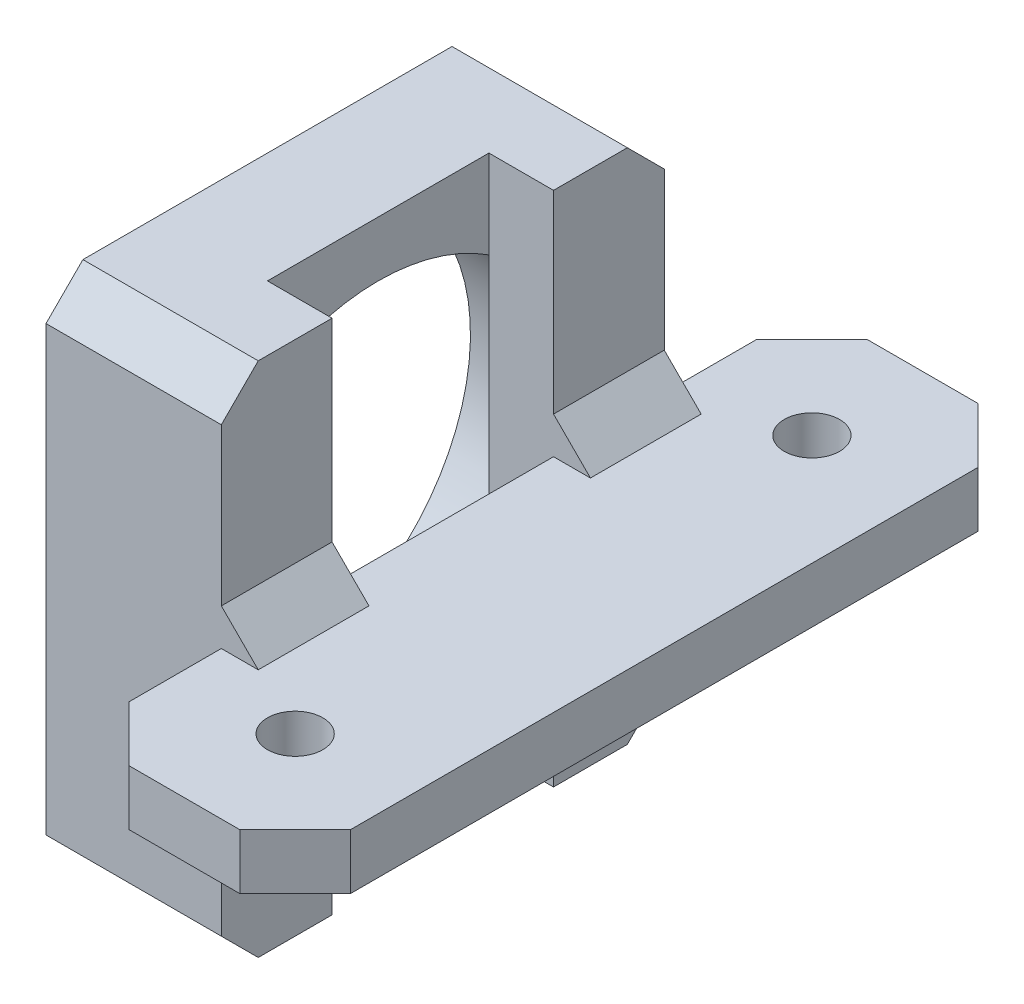
ISO-10303-21;
HEADER;
FILE_DESCRIPTION(('STEP AP214'),'2;1');
FILE_NAME('part.step','',(''),(''),'','','');
FILE_SCHEMA(('AUTOMOTIVE_DESIGN { 1 0 10303 214 1 1 1 1 }'));
ENDSEC;
DATA;
#1=APPLICATION_CONTEXT('core data for automotive mechanical design processes');
#2=APPLICATION_PROTOCOL_DEFINITION('international standard','automotive_design',2000,#1);
#3=PRODUCT_CONTEXT('',#1,'mechanical');
#4=PRODUCT('Part','Part','',(#3));
#5=PRODUCT_RELATED_PRODUCT_CATEGORY('part','',(#4));
#6=PRODUCT_DEFINITION_FORMATION('','',#4);
#7=PRODUCT_DEFINITION_CONTEXT('part definition',#1,'design');
#8=PRODUCT_DEFINITION('design','',#6,#7);
#9=PRODUCT_DEFINITION_SHAPE('','',#8);
#10=(LENGTH_UNIT() NAMED_UNIT(*) SI_UNIT(.MILLI.,.METRE.));
#11=(NAMED_UNIT(*) PLANE_ANGLE_UNIT() SI_UNIT($,.RADIAN.));
#12=(NAMED_UNIT(*) SI_UNIT($,.STERADIAN.) SOLID_ANGLE_UNIT());
#13=UNCERTAINTY_MEASURE_WITH_UNIT(LENGTH_MEASURE(1.E-05),#10,'distance_accuracy_value','');
#14=(GEOMETRIC_REPRESENTATION_CONTEXT(3) GLOBAL_UNCERTAINTY_ASSIGNED_CONTEXT((#13)) GLOBAL_UNIT_ASSIGNED_CONTEXT((#10,
#11,#12)) REPRESENTATION_CONTEXT('',''));
#15=CARTESIAN_POINT('',(0.,0.,0.));
#16=DIRECTION('',(0.,0.,1.));
#17=DIRECTION('',(1.,0.,0.));
#18=AXIS2_PLACEMENT_3D('',#15,#16,#17);
#19=CARTESIAN_POINT('',(-9.5,-12.5,6.));
#20=DIRECTION('',(-1.,0.,0.));
#21=DIRECTION('',(0.,0.,1.));
#22=AXIS2_PLACEMENT_3D('',#19,#20,#21);
#23=PLANE('',#22);
#24=DIRECTION('',(0.,1.,0.));
#25=VECTOR('',#24,1.);
#26=CARTESIAN_POINT('',(-9.5,-12.5,6.));
#27=LINE('',#26,#25);
#28=CARTESIAN_POINT('',(-9.5,-7.71954445729289,6.));
#29=VERTEX_POINT('',#28);
#30=CARTESIAN_POINT('',(-9.5,10.7195444572929,6.));
#31=VERTEX_POINT('',#30);
#32=EDGE_CURVE('E338',#29,#31,#27,.T.);
#33=ORIENTED_EDGE('',*,*,#32,.F.);
#34=CARTESIAN_POINT('',(-9.5,1.5,0.));
#35=DIRECTION('',(-1.,0.,0.));
#36=DIRECTION('',(0.,0.,1.));
#37=AXIS2_PLACEMENT_3D('',#34,#35,#36);
#38=CIRCLE('',#37,11.);
#39=EDGE_CURVE('E607',#29,#31,#38,.T.);
#40=ORIENTED_EDGE('',*,*,#39,.T.);
#41=EDGE_LOOP('',(#33,#40));
#42=FACE_BOUND('',#41,.T.);
#43=ADVANCED_FACE('F95',(#42),#23,.T.);
#44=CARTESIAN_POINT('',(-9.5,-12.5,-12.));
#45=DIRECTION('',(-1.,0.,0.));
#46=DIRECTION('',(0.,0.,1.));
#47=AXIS2_PLACEMENT_3D('',#44,#45,#46);
#48=PLANE('',#47);
#49=DIRECTION('',(0.,1.,0.));
#50=VECTOR('',#49,1.);
#51=CARTESIAN_POINT('',(-9.5,-12.5,-6.));
#52=LINE('',#51,#50);
#53=CARTESIAN_POINT('',(-9.5,-7.71954445729289,-6.));
#54=VERTEX_POINT('',#53);
#55=CARTESIAN_POINT('',(-9.5,10.7195444572929,-6.));
#56=VERTEX_POINT('',#55);
#57=EDGE_CURVE('E573',#54,#56,#52,.T.);
#58=ORIENTED_EDGE('',*,*,#57,.T.);
#59=EDGE_CURVE('E500',#56,#54,#38,.T.);
#60=ORIENTED_EDGE('',*,*,#59,.T.);
#61=EDGE_LOOP('',(#58,#60));
#62=FACE_BOUND('',#61,.T.);
#63=ADVANCED_FACE('F601',(#62),#48,.T.);
#64=CARTESIAN_POINT('',(-6.,3.,-17.));
#65=DIRECTION('',(1.,0.,0.));
#66=DIRECTION('',(0.,0.,-1.));
#67=AXIS2_PLACEMENT_3D('',#64,#65,#66);
#68=PLANE('',#67);
#69=DIRECTION('',(0.,1.,0.));
#70=VECTOR('',#69,1.);
#71=CARTESIAN_POINT('',(-6.,-12.5,-6.));
#72=LINE('',#71,#70);
#73=CARTESIAN_POINT('',(-6.,0.,-6.));
#74=VERTEX_POINT('',#73);
#75=CARTESIAN_POINT('',(-6.,3.,-6.));
#76=VERTEX_POINT('',#75);
#77=EDGE_CURVE('E444',#74,#76,#72,.T.);
#78=ORIENTED_EDGE('',*,*,#77,.F.);
#79=DIRECTION('',(0.,0.,1.));
#80=VECTOR('',#79,1.);
#81=CARTESIAN_POINT('',(-6.,0.,-17.));
#82=LINE('',#81,#80);
#83=CARTESIAN_POINT('',(-6.,0.,6.));
#84=VERTEX_POINT('',#83);
#85=EDGE_CURVE('E420',#74,#84,#82,.T.);
#86=ORIENTED_EDGE('',*,*,#85,.T.);
#87=DIRECTION('',(0.,1.,0.));
#88=VECTOR('',#87,1.);
#89=CARTESIAN_POINT('',(-6.,-12.5,6.));
#90=LINE('',#89,#88);
#91=CARTESIAN_POINT('',(-6.,3.,6.));
#92=VERTEX_POINT('',#91);
#93=EDGE_CURVE('E423',#84,#92,#90,.T.);
#94=ORIENTED_EDGE('',*,*,#93,.T.);
#95=DIRECTION('',(0.,0.,1.));
#96=VECTOR('',#95,1.);
#97=CARTESIAN_POINT('',(-6.,3.,-17.));
#98=LINE('',#97,#96);
#99=EDGE_CURVE('E398',#76,#92,#98,.T.);
#100=ORIENTED_EDGE('',*,*,#99,.F.);
#101=EDGE_LOOP('',(#78,#86,#94,#100));
#102=FACE_BOUND('',#101,.T.);
#103=ADVANCED_FACE('F665',(#102),#68,.F.);
#104=DIRECTION('',(0.,1.,0.));
#105=VECTOR('',#104,1.);
#106=CARTESIAN_POINT('',(-6.,-12.5,12.));
#107=LINE('',#106,#105);
#108=CARTESIAN_POINT('',(-6.,0.,12.));
#109=VERTEX_POINT('',#108);
#110=CARTESIAN_POINT('',(-6.,3.,12.));
#111=VERTEX_POINT('',#110);
#112=EDGE_CURVE('E545',#109,#111,#107,.T.);
#113=ORIENTED_EDGE('',*,*,#112,.F.);
#114=CARTESIAN_POINT('',(-6.,0.,17.));
#115=VERTEX_POINT('',#114);
#116=EDGE_CURVE('E417',#109,#115,#82,.T.);
#117=ORIENTED_EDGE('',*,*,#116,.T.);
#118=DIRECTION('',(0.,-1.,0.));
#119=VECTOR('',#118,1.);
#120=CARTESIAN_POINT('',(-6.,3.,17.));
#121=LINE('',#120,#119);
#122=CARTESIAN_POINT('',(-6.,3.,17.));
#123=VERTEX_POINT('',#122);
#124=EDGE_CURVE('E424',#123,#115,#121,.T.);
#125=ORIENTED_EDGE('',*,*,#124,.F.);
#126=EDGE_CURVE('E393',#111,#123,#98,.T.);
#127=ORIENTED_EDGE('',*,*,#126,.F.);
#128=EDGE_LOOP('',(#113,#117,#125,#127));
#129=FACE_BOUND('',#128,.T.);
#130=ADVANCED_FACE('F649',(#129),#68,.F.);
#131=CARTESIAN_POINT('',(0.,3.,0.));
#132=DIRECTION('',(0.,-1.,0.));
#133=DIRECTION('',(0.,0.,-1.));
#134=AXIS2_PLACEMENT_3D('',#131,#132,#133);
#135=PLANE('',#134);
#136=DIRECTION('',(0.,0.,1.));
#137=VECTOR('',#136,1.);
#138=CARTESIAN_POINT('',(-4.00000000000001,3.,-6.));
#139=LINE('',#138,#137);
#140=CARTESIAN_POINT('',(-4.00000000000001,3.,-12.));
#141=VERTEX_POINT('',#140);
#142=CARTESIAN_POINT('',(-4.00000000000001,3.,-6.));
#143=VERTEX_POINT('',#142);
#144=EDGE_CURVE('E474',#141,#143,#139,.T.);
#145=ORIENTED_EDGE('',*,*,#144,.T.);
#146=DIRECTION('',(-1.,0.,0.));
#147=VECTOR('',#146,1.);
#148=CARTESIAN_POINT('',(0.,3.,-6.));
#149=LINE('',#148,#147);
#150=EDGE_CURVE('E477',#143,#76,#149,.T.);
#151=ORIENTED_EDGE('',*,*,#150,.T.);
#152=ORIENTED_EDGE('',*,*,#99,.T.);
#153=DIRECTION('',(1.,0.,0.));
#154=VECTOR('',#153,1.);
#155=CARTESIAN_POINT('',(-9.5,3.,6.));
#156=LINE('',#155,#154);
#157=CARTESIAN_POINT('',(-4.00000000000001,3.,6.));
#158=VERTEX_POINT('',#157);
#159=EDGE_CURVE('E463',#92,#158,#156,.T.);
#160=ORIENTED_EDGE('',*,*,#159,.T.);
#161=DIRECTION('',(0.,0.,1.));
#162=VECTOR('',#161,1.);
#163=CARTESIAN_POINT('',(-4.00000000000001,3.,12.));
#164=LINE('',#163,#162);
#165=CARTESIAN_POINT('',(-4.00000000000001,3.,12.));
#166=VERTEX_POINT('',#165);
#167=EDGE_CURVE('E466',#158,#166,#164,.T.);
#168=ORIENTED_EDGE('',*,*,#167,.T.);
#169=DIRECTION('',(-1.,0.,0.));
#170=VECTOR('',#169,1.);
#171=CARTESIAN_POINT('',(0.,3.,12.));
#172=LINE('',#171,#170);
#173=EDGE_CURVE('E469',#166,#111,#172,.T.);
#174=ORIENTED_EDGE('',*,*,#173,.T.);
#175=ORIENTED_EDGE('',*,*,#126,.T.);
#176=DIRECTION('',(0.707106781186548,0.,0.707106781186547));
#177=VECTOR('',#176,1.);
#178=CARTESIAN_POINT('',(-6.,3.,17.));
#179=LINE('',#178,#177);
#180=CARTESIAN_POINT('',(-2.99999999999999,3.,20.));
#181=VERTEX_POINT('',#180);
#182=EDGE_CURVE('E391',#123,#181,#179,.T.);
#183=ORIENTED_EDGE('',*,*,#182,.T.);
#184=DIRECTION('',(1.,0.,0.));
#185=VECTOR('',#184,1.);
#186=CARTESIAN_POINT('',(-2.99999999999999,3.,20.));
#187=LINE('',#186,#185);
#188=CARTESIAN_POINT('',(3.00000000000001,3.,20.));
#189=VERTEX_POINT('',#188);
#190=EDGE_CURVE('E389',#181,#189,#187,.T.);
#191=ORIENTED_EDGE('',*,*,#190,.T.);
#192=DIRECTION('',(0.707106781186548,0.,-0.707106781186548));
#193=VECTOR('',#192,1.);
#194=CARTESIAN_POINT('',(3.00000000000001,3.,20.));
#195=LINE('',#194,#193);
#196=CARTESIAN_POINT('',(6.,3.,17.));
#197=VERTEX_POINT('',#196);
#198=EDGE_CURVE('E387',#189,#197,#195,.T.);
#199=ORIENTED_EDGE('',*,*,#198,.T.);
#200=DIRECTION('',(0.,0.,1.));
#201=VECTOR('',#200,1.);
#202=CARTESIAN_POINT('',(6.,3.,-17.));
#203=LINE('',#202,#201);
#204=CARTESIAN_POINT('',(6.,3.,-17.));
#205=VERTEX_POINT('',#204);
#206=EDGE_CURVE('E384',#205,#197,#203,.T.);
#207=ORIENTED_EDGE('',*,*,#206,.F.);
#208=DIRECTION('',(0.707106781186548,0.,0.707106781186547));
#209=VECTOR('',#208,1.);
#210=CARTESIAN_POINT('',(3.,3.,-20.));
#211=LINE('',#210,#209);
#212=CARTESIAN_POINT('',(3.,3.,-20.));
#213=VERTEX_POINT('',#212);
#214=EDGE_CURVE('E381',#213,#205,#211,.T.);
#215=ORIENTED_EDGE('',*,*,#214,.F.);
#216=DIRECTION('',(1.,0.,0.));
#217=VECTOR('',#216,1.);
#218=CARTESIAN_POINT('',(-3.,3.,-20.));
#219=LINE('',#218,#217);
#220=CARTESIAN_POINT('',(-3.,3.,-20.));
#221=VERTEX_POINT('',#220);
#222=EDGE_CURVE('E377',#221,#213,#219,.T.);
#223=ORIENTED_EDGE('',*,*,#222,.F.);
#224=DIRECTION('',(0.707106781186548,0.,-0.707106781186548));
#225=VECTOR('',#224,1.);
#226=CARTESIAN_POINT('',(-6.,3.,-17.));
#227=LINE('',#226,#225);
#228=CARTESIAN_POINT('',(-6.,3.,-17.));
#229=VERTEX_POINT('',#228);
#230=EDGE_CURVE('E374',#229,#221,#227,.T.);
#231=ORIENTED_EDGE('',*,*,#230,.F.);
#232=CARTESIAN_POINT('',(-6.,3.,-12.));
#233=VERTEX_POINT('',#232);
#234=EDGE_CURVE('E394',#229,#233,#98,.T.);
#235=ORIENTED_EDGE('',*,*,#234,.T.);
#236=DIRECTION('',(1.,0.,0.));
#237=VECTOR('',#236,1.);
#238=CARTESIAN_POINT('',(-9.5,3.,-12.));
#239=LINE('',#238,#237);
#240=EDGE_CURVE('E471',#233,#141,#239,.T.);
#241=ORIENTED_EDGE('',*,*,#240,.T.);
#242=EDGE_LOOP('',(#145,#151,#152,#160,#168,#174,#175,#183,#191,#199,#207,#215,#223,#231,#235,#241));
#243=FACE_BOUND('',#242,.T.);
#244=CARTESIAN_POINT('',(0.,3.,-14.));
#245=DIRECTION('',(0.,1.,0.));
#246=DIRECTION('',(0.,0.,1.));
#247=AXIS2_PLACEMENT_3D('',#244,#245,#246);
#248=CIRCLE('',#247,1.5);
#249=CARTESIAN_POINT('',(0.,3.,-12.5));
#250=VERTEX_POINT('',#249);
#251=EDGE_CURVE('E368',#250,#250,#248,.T.);
#252=ORIENTED_EDGE('',*,*,#251,.F.);
#253=EDGE_LOOP('',(#252));
#254=FACE_BOUND('',#253,.T.);
#255=CARTESIAN_POINT('',(0.,3.,14.));
#256=DIRECTION('',(0.,1.,0.));
#257=DIRECTION('',(0.,0.,1.));
#258=AXIS2_PLACEMENT_3D('',#255,#256,#257);
#259=CIRCLE('',#258,1.5);
#260=CARTESIAN_POINT('',(0.,3.,15.5));
#261=VERTEX_POINT('',#260);
#262=EDGE_CURVE('E360',#261,#261,#259,.T.);
#263=ORIENTED_EDGE('',*,*,#262,.F.);
#264=EDGE_LOOP('',(#263));
#265=FACE_BOUND('',#264,.T.);
#266=ADVANCED_FACE('F661',(#243,#254,#265),#135,.F.);
#267=CARTESIAN_POINT('',(0.,0.,0.));
#268=DIRECTION('',(0.,-1.,0.));
#269=DIRECTION('',(0.,0.,-1.));
#270=AXIS2_PLACEMENT_3D('',#267,#268,#269);
#271=PLANE('',#270);
#272=CARTESIAN_POINT('',(0.,0.,-14.));
#273=DIRECTION('',(0.,1.,0.));
#274=DIRECTION('',(0.,0.,1.));
#275=AXIS2_PLACEMENT_3D('',#272,#273,#274);
#276=CIRCLE('',#275,1.5);
#277=CARTESIAN_POINT('',(0.,0.,-12.5));
#278=VERTEX_POINT('',#277);
#279=EDGE_CURVE('E363',#278,#278,#276,.T.);
#280=ORIENTED_EDGE('',*,*,#279,.T.);
#281=EDGE_LOOP('',(#280));
#282=FACE_BOUND('',#281,.T.);
#283=ORIENTED_EDGE('',*,*,#85,.F.);
#284=DIRECTION('',(1.,0.,0.));
#285=VECTOR('',#284,1.);
#286=CARTESIAN_POINT('',(-9.5,0.,-6.));
#287=LINE('',#286,#285);
#288=CARTESIAN_POINT('',(-4.,0.,-6.));
#289=VERTEX_POINT('',#288);
#290=EDGE_CURVE('E457',#74,#289,#287,.T.);
#291=ORIENTED_EDGE('',*,*,#290,.T.);
#292=DIRECTION('',(0.,0.,-1.));
#293=VECTOR('',#292,1.);
#294=CARTESIAN_POINT('',(-4.,0.,0.));
#295=LINE('',#294,#293);
#296=CARTESIAN_POINT('',(-4.00000000000001,0.,-12.));
#297=VERTEX_POINT('',#296);
#298=EDGE_CURVE('E454',#289,#297,#295,.T.);
#299=ORIENTED_EDGE('',*,*,#298,.T.);
#300=DIRECTION('',(-1.,0.,0.));
#301=VECTOR('',#300,1.);
#302=CARTESIAN_POINT('',(0.,0.,-12.));
#303=LINE('',#302,#301);
#304=CARTESIAN_POINT('',(-6.,0.,-12.));
#305=VERTEX_POINT('',#304);
#306=EDGE_CURVE('E452',#297,#305,#303,.T.);
#307=ORIENTED_EDGE('',*,*,#306,.T.);
#308=CARTESIAN_POINT('',(-6.,0.,-17.));
#309=VERTEX_POINT('',#308);
#310=EDGE_CURVE('E378',#309,#305,#82,.T.);
#311=ORIENTED_EDGE('',*,*,#310,.F.);
#312=DIRECTION('',(0.707106781186548,0.,-0.707106781186548));
#313=VECTOR('',#312,1.);
#314=CARTESIAN_POINT('',(-6.,0.,-17.));
#315=LINE('',#314,#313);
#316=CARTESIAN_POINT('',(-3.,0.,-20.));
#317=VERTEX_POINT('',#316);
#318=EDGE_CURVE('E371',#309,#317,#315,.T.);
#319=ORIENTED_EDGE('',*,*,#318,.T.);
#320=DIRECTION('',(1.,0.,0.));
#321=VECTOR('',#320,1.);
#322=CARTESIAN_POINT('',(-3.,0.,-20.));
#323=LINE('',#322,#321);
#324=CARTESIAN_POINT('',(3.,0.,-20.));
#325=VERTEX_POINT('',#324);
#326=EDGE_CURVE('E401',#317,#325,#323,.T.);
#327=ORIENTED_EDGE('',*,*,#326,.T.);
#328=DIRECTION('',(0.707106781186548,0.,0.707106781186547));
#329=VECTOR('',#328,1.);
#330=CARTESIAN_POINT('',(3.,0.,-20.));
#331=LINE('',#330,#329);
#332=CARTESIAN_POINT('',(6.,0.,-17.));
#333=VERTEX_POINT('',#332);
#334=EDGE_CURVE('E404',#325,#333,#331,.T.);
#335=ORIENTED_EDGE('',*,*,#334,.T.);
#336=DIRECTION('',(0.,0.,1.));
#337=VECTOR('',#336,1.);
#338=CARTESIAN_POINT('',(6.,0.,-17.));
#339=LINE('',#338,#337);
#340=CARTESIAN_POINT('',(6.,0.,17.));
#341=VERTEX_POINT('',#340);
#342=EDGE_CURVE('E407',#333,#341,#339,.T.);
#343=ORIENTED_EDGE('',*,*,#342,.T.);
#344=DIRECTION('',(0.707106781186548,0.,-0.707106781186548));
#345=VECTOR('',#344,1.);
#346=CARTESIAN_POINT('',(3.00000000000001,0.,20.));
#347=LINE('',#346,#345);
#348=CARTESIAN_POINT('',(3.00000000000001,0.,20.));
#349=VERTEX_POINT('',#348);
#350=EDGE_CURVE('E410',#349,#341,#347,.T.);
#351=ORIENTED_EDGE('',*,*,#350,.F.);
#352=DIRECTION('',(1.,0.,0.));
#353=VECTOR('',#352,1.);
#354=CARTESIAN_POINT('',(-2.99999999999999,0.,20.));
#355=LINE('',#354,#353);
#356=CARTESIAN_POINT('',(-2.99999999999999,0.,20.));
#357=VERTEX_POINT('',#356);
#358=EDGE_CURVE('E413',#357,#349,#355,.T.);
#359=ORIENTED_EDGE('',*,*,#358,.F.);
#360=DIRECTION('',(0.707106781186548,0.,0.707106781186547));
#361=VECTOR('',#360,1.);
#362=CARTESIAN_POINT('',(-6.,0.,17.));
#363=LINE('',#362,#361);
#364=EDGE_CURVE('E415',#115,#357,#363,.T.);
#365=ORIENTED_EDGE('',*,*,#364,.F.);
#366=ORIENTED_EDGE('',*,*,#116,.F.);
#367=DIRECTION('',(1.,0.,0.));
#368=VECTOR('',#367,1.);
#369=CARTESIAN_POINT('',(-9.5,0.,12.));
#370=LINE('',#369,#368);
#371=CARTESIAN_POINT('',(-4.,0.,12.));
#372=VERTEX_POINT('',#371);
#373=EDGE_CURVE('E449',#109,#372,#370,.T.);
#374=ORIENTED_EDGE('',*,*,#373,.T.);
#375=DIRECTION('',(0.,0.,-1.));
#376=VECTOR('',#375,1.);
#377=CARTESIAN_POINT('',(-4.00000000000001,0.,0.));
#378=LINE('',#377,#376);
#379=CARTESIAN_POINT('',(-4.00000000000001,0.,6.));
#380=VERTEX_POINT('',#379);
#381=EDGE_CURVE('E446',#372,#380,#378,.T.);
#382=ORIENTED_EDGE('',*,*,#381,.T.);
#383=DIRECTION('',(-1.,0.,0.));
#384=VECTOR('',#383,1.);
#385=CARTESIAN_POINT('',(0.,0.,6.00000000000001));
#386=LINE('',#385,#384);
#387=EDGE_CURVE('E443',#380,#84,#386,.T.);
#388=ORIENTED_EDGE('',*,*,#387,.T.);
#389=EDGE_LOOP('',(#283,#291,#299,#307,#311,#319,#327,#335,#343,#351,#359,#365,#366,#374,#382,#388));
#390=FACE_BOUND('',#389,.T.);
#391=CARTESIAN_POINT('',(0.,0.,14.));
#392=DIRECTION('',(0.,1.,0.));
#393=DIRECTION('',(0.,0.,1.));
#394=AXIS2_PLACEMENT_3D('',#391,#392,#393);
#395=CIRCLE('',#394,1.5);
#396=CARTESIAN_POINT('',(0.,0.,15.5));
#397=VERTEX_POINT('',#396);
#398=EDGE_CURVE('E364',#397,#397,#395,.T.);
#399=ORIENTED_EDGE('',*,*,#398,.T.);
#400=EDGE_LOOP('',(#399));
#401=FACE_BOUND('',#400,.T.);
#402=ADVANCED_FACE('F641',(#282,#390,#401),#271,.T.);
#403=CARTESIAN_POINT('',(-6.,3.,-17.));
#404=DIRECTION('',(-0.707106781186547,0.,-0.707106781186547));
#405=DIRECTION('',(-0.707106781186548,0.,0.707106781186548));
#406=AXIS2_PLACEMENT_3D('',#403,#404,#405);
#407=PLANE('',#406);
#408=ORIENTED_EDGE('',*,*,#318,.F.);
#409=DIRECTION('',(0.,-1.,0.));
#410=VECTOR('',#409,1.);
#411=CARTESIAN_POINT('',(-6.,3.,-17.));
#412=LINE('',#411,#410);
#413=EDGE_CURVE('E421',#229,#309,#412,.T.);
#414=ORIENTED_EDGE('',*,*,#413,.F.);
#415=ORIENTED_EDGE('',*,*,#230,.T.);
#416=DIRECTION('',(0.,-1.,0.));
#417=VECTOR('',#416,1.);
#418=CARTESIAN_POINT('',(-3.,3.,-20.));
#419=LINE('',#418,#417);
#420=EDGE_CURVE('E397',#221,#317,#419,.T.);
#421=ORIENTED_EDGE('',*,*,#420,.T.);
#422=EDGE_LOOP('',(#408,#414,#415,#421));
#423=FACE_BOUND('',#422,.T.);
#424=ADVANCED_FACE('F677',(#423),#407,.T.);
#425=ORIENTED_EDGE('',*,*,#310,.T.);
#426=DIRECTION('',(0.,1.,0.));
#427=VECTOR('',#426,1.);
#428=CARTESIAN_POINT('',(-6.,-12.5,-12.));
#429=LINE('',#428,#427);
#430=EDGE_CURVE('E577',#305,#233,#429,.T.);
#431=ORIENTED_EDGE('',*,*,#430,.T.);
#432=ORIENTED_EDGE('',*,*,#234,.F.);
#433=ORIENTED_EDGE('',*,*,#413,.T.);
#434=EDGE_LOOP('',(#425,#431,#432,#433));
#435=FACE_BOUND('',#434,.T.);
#436=ADVANCED_FACE('F706',(#435),#68,.F.);
#437=CARTESIAN_POINT('',(-6.,3.,17.));
#438=DIRECTION('',(0.707106781186547,0.,-0.707106781186548));
#439=DIRECTION('',(-0.707106781186548,0.,-0.707106781186547));
#440=AXIS2_PLACEMENT_3D('',#437,#438,#439);
#441=PLANE('',#440);
#442=ORIENTED_EDGE('',*,*,#364,.T.);
#443=DIRECTION('',(0.,-1.,0.));
#444=VECTOR('',#443,1.);
#445=CARTESIAN_POINT('',(-2.99999999999999,3.,20.));
#446=LINE('',#445,#444);
#447=EDGE_CURVE('E427',#181,#357,#446,.T.);
#448=ORIENTED_EDGE('',*,*,#447,.F.);
#449=ORIENTED_EDGE('',*,*,#182,.F.);
#450=ORIENTED_EDGE('',*,*,#124,.T.);
#451=EDGE_LOOP('',(#442,#448,#449,#450));
#452=FACE_BOUND('',#451,.T.);
#453=ADVANCED_FACE('F704',(#452),#441,.F.);
#454=CARTESIAN_POINT('',(-2.99999999999999,3.,20.));
#455=DIRECTION('',(0.,0.,-1.));
#456=DIRECTION('',(-1.,0.,0.));
#457=AXIS2_PLACEMENT_3D('',#454,#455,#456);
#458=PLANE('',#457);
#459=ORIENTED_EDGE('',*,*,#358,.T.);
#460=DIRECTION('',(0.,-1.,0.));
#461=VECTOR('',#460,1.);
#462=CARTESIAN_POINT('',(3.00000000000001,3.,20.));
#463=LINE('',#462,#461);
#464=EDGE_CURVE('E430',#189,#349,#463,.T.);
#465=ORIENTED_EDGE('',*,*,#464,.F.);
#466=ORIENTED_EDGE('',*,*,#190,.F.);
#467=ORIENTED_EDGE('',*,*,#447,.T.);
#468=EDGE_LOOP('',(#459,#465,#466,#467));
#469=FACE_BOUND('',#468,.T.);
#470=ADVANCED_FACE('F699',(#469),#458,.F.);
#471=CARTESIAN_POINT('',(3.00000000000001,3.,20.));
#472=DIRECTION('',(-0.707106781186547,0.,-0.707106781186547));
#473=DIRECTION('',(-0.707106781186548,0.,0.707106781186548));
#474=AXIS2_PLACEMENT_3D('',#471,#472,#473);
#475=PLANE('',#474);
#476=ORIENTED_EDGE('',*,*,#350,.T.);
#477=DIRECTION('',(0.,-1.,0.));
#478=VECTOR('',#477,1.);
#479=CARTESIAN_POINT('',(6.,3.,17.));
#480=LINE('',#479,#478);
#481=EDGE_CURVE('E433',#197,#341,#480,.T.);
#482=ORIENTED_EDGE('',*,*,#481,.F.);
#483=ORIENTED_EDGE('',*,*,#198,.F.);
#484=ORIENTED_EDGE('',*,*,#464,.T.);
#485=EDGE_LOOP('',(#476,#482,#483,#484));
#486=FACE_BOUND('',#485,.T.);
#487=ADVANCED_FACE('F696',(#486),#475,.F.);
#488=CARTESIAN_POINT('',(6.,3.,-17.));
#489=DIRECTION('',(1.,0.,0.));
#490=DIRECTION('',(0.,0.,-1.));
#491=AXIS2_PLACEMENT_3D('',#488,#489,#490);
#492=PLANE('',#491);
#493=ORIENTED_EDGE('',*,*,#342,.F.);
#494=DIRECTION('',(0.,-1.,0.));
#495=VECTOR('',#494,1.);
#496=CARTESIAN_POINT('',(6.,3.,-17.));
#497=LINE('',#496,#495);
#498=EDGE_CURVE('E435',#205,#333,#497,.T.);
#499=ORIENTED_EDGE('',*,*,#498,.F.);
#500=ORIENTED_EDGE('',*,*,#206,.T.);
#501=ORIENTED_EDGE('',*,*,#481,.T.);
#502=EDGE_LOOP('',(#493,#499,#500,#501));
#503=FACE_BOUND('',#502,.T.);
#504=ADVANCED_FACE('F692',(#503),#492,.T.);
#505=CARTESIAN_POINT('',(3.,3.,-20.));
#506=DIRECTION('',(0.707106781186547,0.,-0.707106781186548));
#507=DIRECTION('',(-0.707106781186548,0.,-0.707106781186547));
#508=AXIS2_PLACEMENT_3D('',#505,#506,#507);
#509=PLANE('',#508);
#510=ORIENTED_EDGE('',*,*,#334,.F.);
#511=DIRECTION('',(0.,-1.,0.));
#512=VECTOR('',#511,1.);
#513=CARTESIAN_POINT('',(3.,3.,-20.));
#514=LINE('',#513,#512);
#515=EDGE_CURVE('E437',#213,#325,#514,.T.);
#516=ORIENTED_EDGE('',*,*,#515,.F.);
#517=ORIENTED_EDGE('',*,*,#214,.T.);
#518=ORIENTED_EDGE('',*,*,#498,.T.);
#519=EDGE_LOOP('',(#510,#516,#517,#518));
#520=FACE_BOUND('',#519,.T.);
#521=ADVANCED_FACE('F688',(#520),#509,.T.);
#522=CARTESIAN_POINT('',(-3.,3.,-20.));
#523=DIRECTION('',(0.,0.,-1.));
#524=DIRECTION('',(-1.,0.,0.));
#525=AXIS2_PLACEMENT_3D('',#522,#523,#524);
#526=PLANE('',#525);
#527=ORIENTED_EDGE('',*,*,#326,.F.);
#528=ORIENTED_EDGE('',*,*,#420,.F.);
#529=ORIENTED_EDGE('',*,*,#222,.T.);
#530=ORIENTED_EDGE('',*,*,#515,.T.);
#531=EDGE_LOOP('',(#527,#528,#529,#530));
#532=FACE_BOUND('',#531,.T.);
#533=ADVANCED_FACE('F683',(#532),#526,.T.);
#534=CARTESIAN_POINT('',(0.,3.,-14.));
#535=DIRECTION('',(0.,-1.,0.));
#536=DIRECTION('',(0.,0.,-1.));
#537=AXIS2_PLACEMENT_3D('',#534,#535,#536);
#538=CYLINDRICAL_SURFACE('',#537,1.5);
#539=ORIENTED_EDGE('',*,*,#251,.T.);
#540=EDGE_LOOP('',(#539));
#541=FACE_BOUND('',#540,.T.);
#542=ORIENTED_EDGE('',*,*,#279,.F.);
#543=EDGE_LOOP('',(#542));
#544=FACE_BOUND('',#543,.T.);
#545=ADVANCED_FACE('F732',(#541,#544),#538,.F.);
#546=CARTESIAN_POINT('',(0.,3.,14.));
#547=DIRECTION('',(0.,-1.,0.));
#548=DIRECTION('',(0.,0.,-1.));
#549=AXIS2_PLACEMENT_3D('',#546,#547,#548);
#550=CYLINDRICAL_SURFACE('',#549,1.5);
#551=ORIENTED_EDGE('',*,*,#262,.T.);
#552=EDGE_LOOP('',(#551));
#553=FACE_BOUND('',#552,.T.);
#554=ORIENTED_EDGE('',*,*,#398,.F.);
#555=EDGE_LOOP('',(#554));
#556=FACE_BOUND('',#555,.T.);
#557=ADVANCED_FACE('F729',(#553,#556),#550,.F.);
#558=CARTESIAN_POINT('',(-6.,-12.5,6.));
#559=DIRECTION('',(-1.,0.,0.));
#560=DIRECTION('',(0.,0.,1.));
#561=AXIS2_PLACEMENT_3D('',#558,#559,#560);
#562=PLANE('',#561);
#563=CARTESIAN_POINT('',(-6.,-10.5,12.));
#564=VERTEX_POINT('',#563);
#565=CARTESIAN_POINT('',(-6.,-1.99999999999999,12.));
#566=VERTEX_POINT('',#565);
#567=EDGE_CURVE('E542',#564,#566,#107,.T.);
#568=ORIENTED_EDGE('',*,*,#567,.F.);
#569=DIRECTION('',(0.,0.707106781186546,0.707106781186549));
#570=VECTOR('',#569,1.);
#571=CARTESIAN_POINT('',(-6.,-10.5,12.));
#572=LINE('',#571,#570);
#573=CARTESIAN_POINT('',(-6.,-12.5,9.99999999999999));
#574=VERTEX_POINT('',#573);
#575=EDGE_CURVE('E526',#564,#574,#572,.F.);
#576=ORIENTED_EDGE('',*,*,#575,.T.);
#577=DIRECTION('',(0.,0.,1.));
#578=VECTOR('',#577,1.);
#579=CARTESIAN_POINT('',(-6.,-12.5,6.));
#580=LINE('',#579,#578);
#581=CARTESIAN_POINT('',(-6.,-12.5,6.));
#582=VERTEX_POINT('',#581);
#583=EDGE_CURVE('E355',#582,#574,#580,.T.);
#584=ORIENTED_EDGE('',*,*,#583,.F.);
#585=CARTESIAN_POINT('',(-6.,-1.99999999999999,6.));
#586=VERTEX_POINT('',#585);
#587=EDGE_CURVE('E543',#582,#586,#90,.T.);
#588=ORIENTED_EDGE('',*,*,#587,.T.);
#589=DIRECTION('',(0.,0.,1.));
#590=VECTOR('',#589,1.);
#591=CARTESIAN_POINT('',(-6.,-1.99999999999999,6.));
#592=LINE('',#591,#590);
#593=EDGE_CURVE('E460',#586,#566,#592,.T.);
#594=ORIENTED_EDGE('',*,*,#593,.T.);
#595=EDGE_LOOP('',(#568,#576,#584,#588,#594));
#596=FACE_BOUND('',#595,.T.);
#597=ADVANCED_FACE('F631',(#596),#562,.F.);
#598=CARTESIAN_POINT('',(-9.5,-12.5,6.));
#599=DIRECTION('',(0.,0.,1.));
#600=DIRECTION('',(1.,0.,0.));
#601=AXIS2_PLACEMENT_3D('',#598,#599,#600);
#602=PLANE('',#601);
#603=DIRECTION('',(1.,0.,0.));
#604=VECTOR('',#603,1.);
#605=CARTESIAN_POINT('',(-9.5,15.5,6.));
#606=LINE('',#605,#604);
#607=CARTESIAN_POINT('',(-9.5,15.5,6.));
#608=VERTEX_POINT('',#607);
#609=CARTESIAN_POINT('',(-6.,15.5,6.));
#610=VERTEX_POINT('',#609);
#611=EDGE_CURVE('E335',#608,#610,#606,.T.);
#612=ORIENTED_EDGE('',*,*,#611,.T.);
#613=CARTESIAN_POINT('',(-6.,4.99999999999999,6.));
#614=VERTEX_POINT('',#613);
#615=EDGE_CURVE('E339',#614,#610,#90,.T.);
#616=ORIENTED_EDGE('',*,*,#615,.F.);
#617=DIRECTION('',(-0.707106781186548,0.707106781186547,0.));
#618=VECTOR('',#617,1.);
#619=CARTESIAN_POINT('',(0.99999999999999,-2.,6.00000000000001));
#620=LINE('',#619,#618);
#621=EDGE_CURVE('E498',#614,#158,#620,.F.);
#622=ORIENTED_EDGE('',*,*,#621,.T.);
#623=ORIENTED_EDGE('',*,*,#159,.F.);
#624=ORIENTED_EDGE('',*,*,#93,.F.);
#625=ORIENTED_EDGE('',*,*,#387,.F.);
#626=DIRECTION('',(-0.707106781186548,-0.707106781186547,0.));
#627=VECTOR('',#626,1.);
#628=CARTESIAN_POINT('',(-13.,-9.,6.));
#629=LINE('',#628,#627);
#630=EDGE_CURVE('E490',#380,#586,#629,.T.);
#631=ORIENTED_EDGE('',*,*,#630,.T.);
#632=ORIENTED_EDGE('',*,*,#587,.F.);
#633=DIRECTION('',(1.,0.,0.));
#634=VECTOR('',#633,1.);
#635=CARTESIAN_POINT('',(-9.5,-12.5,6.));
#636=LINE('',#635,#634);
#637=CARTESIAN_POINT('',(-9.5,-12.5,6.));
#638=VERTEX_POINT('',#637);
#639=EDGE_CURVE('E352',#638,#582,#636,.T.);
#640=ORIENTED_EDGE('',*,*,#639,.F.);
#641=EDGE_CURVE('E342',#638,#29,#27,.T.);
#642=ORIENTED_EDGE('',*,*,#641,.T.);
#643=ORIENTED_EDGE('',*,*,#32,.T.);
#644=EDGE_CURVE('E319',#31,#608,#27,.T.);
#645=ORIENTED_EDGE('',*,*,#644,.T.);
#646=EDGE_LOOP('',(#612,#616,#622,#623,#624,#625,#631,#632,#640,#642,#643,#645));
#647=FACE_BOUND('',#646,.T.);
#648=ADVANCED_FACE('F333',(#647),#602,.F.);
#649=DIRECTION('',(0.,0.,1.));
#650=VECTOR('',#649,1.);
#651=CARTESIAN_POINT('',(-6.,15.5,6.));
#652=LINE('',#651,#650);
#653=CARTESIAN_POINT('',(-6.,15.5,10.));
#654=VERTEX_POINT('',#653);
#655=EDGE_CURVE('E347',#610,#654,#652,.T.);
#656=ORIENTED_EDGE('',*,*,#655,.T.);
#657=DIRECTION('',(0.,-0.707106781186549,0.707106781186546));
#658=VECTOR('',#657,1.);
#659=CARTESIAN_POINT('',(-6.,15.5,10.));
#660=LINE('',#659,#658);
#661=CARTESIAN_POINT('',(-6.,13.5,12.));
#662=VERTEX_POINT('',#661);
#663=EDGE_CURVE('E104',#654,#662,#660,.T.);
#664=ORIENTED_EDGE('',*,*,#663,.T.);
#665=CARTESIAN_POINT('',(-6.,4.99999999999999,12.));
#666=VERTEX_POINT('',#665);
#667=EDGE_CURVE('E535',#666,#662,#107,.T.);
#668=ORIENTED_EDGE('',*,*,#667,.F.);
#669=DIRECTION('',(0.,0.,-1.));
#670=VECTOR('',#669,1.);
#671=CARTESIAN_POINT('',(-6.,4.99999999999999,6.));
#672=LINE('',#671,#670);
#673=EDGE_CURVE('E481',#666,#614,#672,.T.);
#674=ORIENTED_EDGE('',*,*,#673,.T.);
#675=ORIENTED_EDGE('',*,*,#615,.T.);
#676=EDGE_LOOP('',(#656,#664,#668,#674,#675));
#677=FACE_BOUND('',#676,.T.);
#678=ADVANCED_FACE('F534',(#677),#562,.F.);
#679=CARTESIAN_POINT('',(-9.5,-12.5,12.));
#680=DIRECTION('',(0.,0.,1.));
#681=DIRECTION('',(1.,0.,0.));
#682=AXIS2_PLACEMENT_3D('',#679,#680,#681);
#683=PLANE('',#682);
#684=DIRECTION('',(0.,1.,0.));
#685=VECTOR('',#684,1.);
#686=CARTESIAN_POINT('',(-15.5,15.5,12.));
#687=LINE('',#686,#685);
#688=CARTESIAN_POINT('',(-15.5,-10.5,12.));
#689=VERTEX_POINT('',#688);
#690=CARTESIAN_POINT('',(-15.5,13.5,12.));
#691=VERTEX_POINT('',#690);
#692=EDGE_CURVE('E554',#689,#691,#687,.T.);
#693=ORIENTED_EDGE('',*,*,#692,.F.);
#694=DIRECTION('',(1.,0.,0.));
#695=VECTOR('',#694,1.);
#696=CARTESIAN_POINT('',(-9.5,-10.5,12.));
#697=LINE('',#696,#695);
#698=EDGE_CURVE('E523',#689,#564,#697,.T.);
#699=ORIENTED_EDGE('',*,*,#698,.T.);
#700=ORIENTED_EDGE('',*,*,#567,.T.);
#701=DIRECTION('',(0.707106781186548,0.707106781186547,0.));
#702=VECTOR('',#701,1.);
#703=CARTESIAN_POINT('',(-6.,-2.,12.));
#704=LINE('',#703,#702);
#705=EDGE_CURVE('E488',#566,#372,#704,.T.);
#706=ORIENTED_EDGE('',*,*,#705,.T.);
#707=ORIENTED_EDGE('',*,*,#373,.F.);
#708=ORIENTED_EDGE('',*,*,#112,.T.);
#709=ORIENTED_EDGE('',*,*,#173,.F.);
#710=DIRECTION('',(0.707106781186548,-0.707106781186547,0.));
#711=VECTOR('',#710,1.);
#712=CARTESIAN_POINT('',(-4.00000000000001,3.,12.));
#713=LINE('',#712,#711);
#714=EDGE_CURVE('E496',#166,#666,#713,.F.);
#715=ORIENTED_EDGE('',*,*,#714,.T.);
#716=ORIENTED_EDGE('',*,*,#667,.T.);
#717=DIRECTION('',(-1.,0.,0.));
#718=VECTOR('',#717,1.);
#719=CARTESIAN_POINT('',(-15.5,13.5,12.));
#720=LINE('',#719,#718);
#721=EDGE_CURVE('E521',#662,#691,#720,.T.);
#722=ORIENTED_EDGE('',*,*,#721,.T.);
#723=EDGE_LOOP('',(#693,#699,#700,#706,#707,#708,#709,#715,#716,#722));
#724=FACE_BOUND('',#723,.T.);
#725=ADVANCED_FACE('F539',(#724),#683,.T.);
#726=CARTESIAN_POINT('',(-6.,-12.5,-12.));
#727=DIRECTION('',(-1.,0.,0.));
#728=DIRECTION('',(0.,0.,1.));
#729=AXIS2_PLACEMENT_3D('',#726,#727,#728);
#730=PLANE('',#729);
#731=DIRECTION('',(0.,0.,1.));
#732=VECTOR('',#731,1.);
#733=CARTESIAN_POINT('',(-6.,-12.5,-12.));
#734=LINE('',#733,#732);
#735=CARTESIAN_POINT('',(-6.,-12.5,-9.99999999999999));
#736=VERTEX_POINT('',#735);
#737=CARTESIAN_POINT('',(-6.,-12.5,-6.));
#738=VERTEX_POINT('',#737);
#739=EDGE_CURVE('E567',#736,#738,#734,.T.);
#740=ORIENTED_EDGE('',*,*,#739,.F.);
#741=DIRECTION('',(0.,0.707106781186549,-0.707106781186546));
#742=VECTOR('',#741,1.);
#743=CARTESIAN_POINT('',(-6.,-12.5,-9.99999999999999));
#744=LINE('',#743,#742);
#745=CARTESIAN_POINT('',(-6.,-10.5,-12.));
#746=VERTEX_POINT('',#745);
#747=EDGE_CURVE('E506',#736,#746,#744,.T.);
#748=ORIENTED_EDGE('',*,*,#747,.T.);
#749=CARTESIAN_POINT('',(-6.,-1.99999999999999,-12.));
#750=VERTEX_POINT('',#749);
#751=EDGE_CURVE('E574',#746,#750,#429,.T.);
#752=ORIENTED_EDGE('',*,*,#751,.T.);
#753=DIRECTION('',(0.,0.,1.));
#754=VECTOR('',#753,1.);
#755=CARTESIAN_POINT('',(-6.,-1.99999999999999,-12.));
#756=LINE('',#755,#754);
#757=CARTESIAN_POINT('',(-6.,-1.99999999999999,-6.));
#758=VERTEX_POINT('',#757);
#759=EDGE_CURVE('E440',#750,#758,#756,.T.);
#760=ORIENTED_EDGE('',*,*,#759,.T.);
#761=EDGE_CURVE('E578',#738,#758,#72,.T.);
#762=ORIENTED_EDGE('',*,*,#761,.F.);
#763=EDGE_LOOP('',(#740,#748,#752,#760,#762));
#764=FACE_BOUND('',#763,.T.);
#765=ADVANCED_FACE('F822',(#764),#730,.F.);
#766=CARTESIAN_POINT('',(-9.5,-12.5,-6.));
#767=DIRECTION('',(0.,0.,1.));
#768=DIRECTION('',(1.,0.,0.));
#769=AXIS2_PLACEMENT_3D('',#766,#767,#768);
#770=PLANE('',#769);
#771=DIRECTION('',(1.,0.,0.));
#772=VECTOR('',#771,1.);
#773=CARTESIAN_POINT('',(-9.5,15.5,-6.));
#774=LINE('',#773,#772);
#775=CARTESIAN_POINT('',(-9.5,15.5,-6.));
#776=VERTEX_POINT('',#775);
#777=CARTESIAN_POINT('',(-6.,15.5,-6.));
#778=VERTEX_POINT('',#777);
#779=EDGE_CURVE('E348',#776,#778,#774,.T.);
#780=ORIENTED_EDGE('',*,*,#779,.F.);
#781=EDGE_CURVE('E322',#56,#776,#52,.T.);
#782=ORIENTED_EDGE('',*,*,#781,.F.);
#783=ORIENTED_EDGE('',*,*,#57,.F.);
#784=CARTESIAN_POINT('',(-9.5,-12.5,-6.));
#785=VERTEX_POINT('',#784);
#786=EDGE_CURVE('E367',#785,#54,#52,.T.);
#787=ORIENTED_EDGE('',*,*,#786,.F.);
#788=DIRECTION('',(1.,0.,0.));
#789=VECTOR('',#788,1.);
#790=CARTESIAN_POINT('',(-9.5,-12.5,-6.));
#791=LINE('',#790,#789);
#792=EDGE_CURVE('E564',#785,#738,#791,.T.);
#793=ORIENTED_EDGE('',*,*,#792,.T.);
#794=ORIENTED_EDGE('',*,*,#761,.T.);
#795=DIRECTION('',(0.707106781186548,0.707106781186548,0.));
#796=VECTOR('',#795,1.);
#797=CARTESIAN_POINT('',(-6.,-2.,-6.));
#798=LINE('',#797,#796);
#799=EDGE_CURVE('E483',#758,#289,#798,.T.);
#800=ORIENTED_EDGE('',*,*,#799,.T.);
#801=ORIENTED_EDGE('',*,*,#290,.F.);
#802=ORIENTED_EDGE('',*,*,#77,.T.);
#803=ORIENTED_EDGE('',*,*,#150,.F.);
#804=DIRECTION('',(0.707106781186548,-0.707106781186547,0.));
#805=VECTOR('',#804,1.);
#806=CARTESIAN_POINT('',(-4.00000000000001,3.,-6.));
#807=LINE('',#806,#805);
#808=CARTESIAN_POINT('',(-6.,4.99999999999999,-6.));
#809=VERTEX_POINT('',#808);
#810=EDGE_CURVE('E492',#143,#809,#807,.F.);
#811=ORIENTED_EDGE('',*,*,#810,.T.);
#812=EDGE_CURVE('E568',#809,#778,#72,.T.);
#813=ORIENTED_EDGE('',*,*,#812,.T.);
#814=EDGE_LOOP('',(#780,#782,#783,#787,#793,#794,#800,#801,#802,#803,#811,#813));
#815=FACE_BOUND('',#814,.T.);
#816=ADVANCED_FACE('F596',(#815),#770,.T.);
#817=CARTESIAN_POINT('',(-9.5,-12.5,-12.));
#818=DIRECTION('',(0.,0.,1.));
#819=DIRECTION('',(1.,0.,0.));
#820=AXIS2_PLACEMENT_3D('',#817,#818,#819);
#821=PLANE('',#820);
#822=ORIENTED_EDGE('',*,*,#751,.F.);
#823=DIRECTION('',(-1.,0.,0.));
#824=VECTOR('',#823,1.);
#825=CARTESIAN_POINT('',(-15.5,-10.5,-12.));
#826=LINE('',#825,#824);
#827=CARTESIAN_POINT('',(-15.5,-10.5,-12.));
#828=VERTEX_POINT('',#827);
#829=EDGE_CURVE('E511',#746,#828,#826,.T.);
#830=ORIENTED_EDGE('',*,*,#829,.T.);
#831=DIRECTION('',(0.,-1.,0.));
#832=VECTOR('',#831,1.);
#833=CARTESIAN_POINT('',(-15.5,15.5,-12.));
#834=LINE('',#833,#832);
#835=CARTESIAN_POINT('',(-15.5,13.5,-12.));
#836=VERTEX_POINT('',#835);
#837=EDGE_CURVE('E327',#836,#828,#834,.T.);
#838=ORIENTED_EDGE('',*,*,#837,.F.);
#839=DIRECTION('',(1.,0.,0.));
#840=VECTOR('',#839,1.);
#841=CARTESIAN_POINT('',(-9.5,13.5,-12.));
#842=LINE('',#841,#840);
#843=CARTESIAN_POINT('',(-6.,13.5,-12.));
#844=VERTEX_POINT('',#843);
#845=EDGE_CURVE('E508',#836,#844,#842,.T.);
#846=ORIENTED_EDGE('',*,*,#845,.T.);
#847=CARTESIAN_POINT('',(-6.,4.99999999999999,-12.));
#848=VERTEX_POINT('',#847);
#849=EDGE_CURVE('E576',#848,#844,#429,.T.);
#850=ORIENTED_EDGE('',*,*,#849,.F.);
#851=DIRECTION('',(-0.707106781186548,0.707106781186547,0.));
#852=VECTOR('',#851,1.);
#853=CARTESIAN_POINT('',(0.999999999999992,-2.,-12.));
#854=LINE('',#853,#852);
#855=EDGE_CURVE('E494',#848,#141,#854,.F.);
#856=ORIENTED_EDGE('',*,*,#855,.T.);
#857=ORIENTED_EDGE('',*,*,#240,.F.);
#858=ORIENTED_EDGE('',*,*,#430,.F.);
#859=ORIENTED_EDGE('',*,*,#306,.F.);
#860=DIRECTION('',(-0.707106781186548,-0.707106781186548,0.));
#861=VECTOR('',#860,1.);
#862=CARTESIAN_POINT('',(-13.,-9.,-12.));
#863=LINE('',#862,#861);
#864=EDGE_CURVE('E485',#297,#750,#863,.T.);
#865=ORIENTED_EDGE('',*,*,#864,.T.);
#866=EDGE_LOOP('',(#822,#830,#838,#846,#850,#856,#857,#858,#859,#865));
#867=FACE_BOUND('',#866,.T.);
#868=ADVANCED_FACE('F618',(#867),#821,.F.);
#869=ORIENTED_EDGE('',*,*,#849,.T.);
#870=DIRECTION('',(0.,-0.707106781186546,-0.707106781186549));
#871=VECTOR('',#870,1.);
#872=CARTESIAN_POINT('',(-6.,13.5,-12.));
#873=LINE('',#872,#871);
#874=CARTESIAN_POINT('',(-6.,15.5,-9.99999999999999));
#875=VERTEX_POINT('',#874);
#876=EDGE_CURVE('E12',#844,#875,#873,.F.);
#877=ORIENTED_EDGE('',*,*,#876,.T.);
#878=DIRECTION('',(0.,0.,1.));
#879=VECTOR('',#878,1.);
#880=CARTESIAN_POINT('',(-6.,15.5,-12.));
#881=LINE('',#880,#879);
#882=EDGE_CURVE('E350',#875,#778,#881,.T.);
#883=ORIENTED_EDGE('',*,*,#882,.T.);
#884=ORIENTED_EDGE('',*,*,#812,.F.);
#885=DIRECTION('',(0.,0.,-1.));
#886=VECTOR('',#885,1.);
#887=CARTESIAN_POINT('',(-6.,4.99999999999999,-12.));
#888=LINE('',#887,#886);
#889=EDGE_CURVE('E479',#809,#848,#888,.T.);
#890=ORIENTED_EDGE('',*,*,#889,.T.);
#891=EDGE_LOOP('',(#869,#877,#883,#884,#890));
#892=FACE_BOUND('',#891,.T.);
#893=ADVANCED_FACE('F797',(#892),#730,.F.);
#894=CARTESIAN_POINT('',(0.,-12.5,0.));
#895=DIRECTION('',(0.,-1.,0.));
#896=DIRECTION('',(0.,0.,-1.));
#897=AXIS2_PLACEMENT_3D('',#894,#895,#896);
#898=PLANE('',#897);
#899=DIRECTION('',(0.,0.,1.));
#900=VECTOR('',#899,1.);
#901=CARTESIAN_POINT('',(-15.5,-12.5,-12.));
#902=LINE('',#901,#900);
#903=CARTESIAN_POINT('',(-15.5,-12.5,-10.));
#904=VERTEX_POINT('',#903);
#905=CARTESIAN_POINT('',(-15.5,-12.5,9.99999999999999));
#906=VERTEX_POINT('',#905);
#907=EDGE_CURVE('E557',#904,#906,#902,.T.);
#908=ORIENTED_EDGE('',*,*,#907,.F.);
#909=DIRECTION('',(1.,0.,0.));
#910=VECTOR('',#909,1.);
#911=CARTESIAN_POINT('',(-6.,-12.5,-9.99999999999999));
#912=LINE('',#911,#910);
#913=EDGE_CURVE('E503',#904,#736,#912,.T.);
#914=ORIENTED_EDGE('',*,*,#913,.T.);
#915=ORIENTED_EDGE('',*,*,#739,.T.);
#916=ORIENTED_EDGE('',*,*,#792,.F.);
#917=DIRECTION('',(0.,0.,1.));
#918=VECTOR('',#917,1.);
#919=CARTESIAN_POINT('',(-9.5,-12.5,-12.));
#920=LINE('',#919,#918);
#921=EDGE_CURVE('E328',#785,#638,#920,.T.);
#922=ORIENTED_EDGE('',*,*,#921,.T.);
#923=ORIENTED_EDGE('',*,*,#639,.T.);
#924=ORIENTED_EDGE('',*,*,#583,.T.);
#925=DIRECTION('',(-1.,0.,0.));
#926=VECTOR('',#925,1.);
#927=CARTESIAN_POINT('',(0.,-12.5,9.99999999999999));
#928=LINE('',#927,#926);
#929=EDGE_CURVE('E501',#574,#906,#928,.T.);
#930=ORIENTED_EDGE('',*,*,#929,.T.);
#931=EDGE_LOOP('',(#908,#914,#915,#916,#922,#923,#924,#930));
#932=FACE_BOUND('',#931,.T.);
#933=ADVANCED_FACE('F592',(#932),#898,.T.);
#934=CARTESIAN_POINT('',(0.,15.5,0.));
#935=DIRECTION('',(0.,-1.,0.));
#936=DIRECTION('',(0.,0.,-1.));
#937=AXIS2_PLACEMENT_3D('',#934,#935,#936);
#938=PLANE('',#937);
#939=DIRECTION('',(0.,0.,-1.));
#940=VECTOR('',#939,1.);
#941=CARTESIAN_POINT('',(-15.5,15.5,-12.));
#942=LINE('',#941,#940);
#943=CARTESIAN_POINT('',(-15.5,15.5,10.));
#944=VERTEX_POINT('',#943);
#945=CARTESIAN_POINT('',(-15.5,15.5,-9.99999999999999));
#946=VERTEX_POINT('',#945);
#947=EDGE_CURVE('E340',#944,#946,#942,.T.);
#948=ORIENTED_EDGE('',*,*,#947,.F.);
#949=DIRECTION('',(1.,0.,0.));
#950=VECTOR('',#949,1.);
#951=CARTESIAN_POINT('',(-6.,15.5,10.));
#952=LINE('',#951,#950);
#953=EDGE_CURVE('E530',#944,#654,#952,.T.);
#954=ORIENTED_EDGE('',*,*,#953,.T.);
#955=ORIENTED_EDGE('',*,*,#655,.F.);
#956=ORIENTED_EDGE('',*,*,#611,.F.);
#957=DIRECTION('',(0.,0.,-1.));
#958=VECTOR('',#957,1.);
#959=CARTESIAN_POINT('',(-9.5,15.5,-12.));
#960=LINE('',#959,#958);
#961=EDGE_CURVE('E315',#608,#776,#960,.T.);
#962=ORIENTED_EDGE('',*,*,#961,.T.);
#963=ORIENTED_EDGE('',*,*,#779,.T.);
#964=ORIENTED_EDGE('',*,*,#882,.F.);
#965=DIRECTION('',(-1.,0.,0.));
#966=VECTOR('',#965,1.);
#967=CARTESIAN_POINT('',(0.,15.5,-9.99999999999998));
#968=LINE('',#967,#966);
#969=EDGE_CURVE('E528',#875,#946,#968,.T.);
#970=ORIENTED_EDGE('',*,*,#969,.T.);
#971=EDGE_LOOP('',(#948,#954,#955,#956,#962,#963,#964,#970));
#972=FACE_BOUND('',#971,.T.);
#973=ADVANCED_FACE('F345',(#972),#938,.F.);
#974=CARTESIAN_POINT('',(-6.,-1.99999999999999,-12.));
#975=DIRECTION('',(-0.707106781186548,0.707106781186548,0.));
#976=DIRECTION('',(0.,0.,1.));
#977=AXIS2_PLACEMENT_3D('',#974,#975,#976);
#978=PLANE('',#977);
#979=ORIENTED_EDGE('',*,*,#864,.F.);
#980=ORIENTED_EDGE('',*,*,#298,.F.);
#981=ORIENTED_EDGE('',*,*,#799,.F.);
#982=ORIENTED_EDGE('',*,*,#759,.F.);
#983=EDGE_LOOP('',(#979,#980,#981,#982));
#984=FACE_BOUND('',#983,.T.);
#985=ADVANCED_FACE('F670',(#984),#978,.F.);
#986=CARTESIAN_POINT('',(-6.,-1.99999999999999,6.));
#987=DIRECTION('',(-0.707106781186547,0.707106781186548,0.));
#988=DIRECTION('',(0.,0.,1.));
#989=AXIS2_PLACEMENT_3D('',#986,#987,#988);
#990=PLANE('',#989);
#991=ORIENTED_EDGE('',*,*,#630,.F.);
#992=ORIENTED_EDGE('',*,*,#381,.F.);
#993=ORIENTED_EDGE('',*,*,#705,.F.);
#994=ORIENTED_EDGE('',*,*,#593,.F.);
#995=EDGE_LOOP('',(#991,#992,#993,#994));
#996=FACE_BOUND('',#995,.T.);
#997=ADVANCED_FACE('F635',(#996),#990,.F.);
#998=CARTESIAN_POINT('',(-4.00000000000001,3.,0.));
#999=DIRECTION('',(0.707106781186547,0.707106781186548,0.));
#1000=DIRECTION('',(0.,0.,-1.));
#1001=AXIS2_PLACEMENT_3D('',#998,#999,#1000);
#1002=PLANE('',#1001);
#1003=ORIENTED_EDGE('',*,*,#855,.F.);
#1004=ORIENTED_EDGE('',*,*,#889,.F.);
#1005=ORIENTED_EDGE('',*,*,#810,.F.);
#1006=ORIENTED_EDGE('',*,*,#144,.F.);
#1007=EDGE_LOOP('',(#1003,#1004,#1005,#1006));
#1008=FACE_BOUND('',#1007,.T.);
#1009=ADVANCED_FACE('F761',(#1008),#1002,.T.);
#1010=CARTESIAN_POINT('',(-4.00000000000001,3.,0.));
#1011=DIRECTION('',(0.707106781186547,0.707106781186548,0.));
#1012=DIRECTION('',(0.,0.,-1.));
#1013=AXIS2_PLACEMENT_3D('',#1010,#1011,#1012);
#1014=PLANE('',#1013);
#1015=ORIENTED_EDGE('',*,*,#621,.F.);
#1016=ORIENTED_EDGE('',*,*,#673,.F.);
#1017=ORIENTED_EDGE('',*,*,#714,.F.);
#1018=ORIENTED_EDGE('',*,*,#167,.F.);
#1019=EDGE_LOOP('',(#1015,#1016,#1017,#1018));
#1020=FACE_BOUND('',#1019,.T.);
#1021=ADVANCED_FACE('F659',(#1020),#1014,.T.);
#1022=CARTESIAN_POINT('',(-9.5,0.,0.));
#1023=DIRECTION('',(-1.,0.,0.));
#1024=DIRECTION('',(0.,0.,1.));
#1025=AXIS2_PLACEMENT_3D('',#1022,#1023,#1024);
#1026=PLANE('',#1025);
#1027=ORIENTED_EDGE('',*,*,#641,.F.);
#1028=ORIENTED_EDGE('',*,*,#921,.F.);
#1029=ORIENTED_EDGE('',*,*,#786,.T.);
#1030=EDGE_CURVE('E588',#54,#29,#38,.T.);
#1031=ORIENTED_EDGE('',*,*,#1030,.T.);
#1032=EDGE_LOOP('',(#1027,#1028,#1029,#1031));
#1033=FACE_BOUND('',#1032,.T.);
#1034=ADVANCED_FACE('F586',(#1033),#1026,.F.);
#1035=ORIENTED_EDGE('',*,*,#644,.F.);
#1036=EDGE_CURVE('E604',#31,#56,#38,.T.);
#1037=ORIENTED_EDGE('',*,*,#1036,.T.);
#1038=ORIENTED_EDGE('',*,*,#781,.T.);
#1039=ORIENTED_EDGE('',*,*,#961,.F.);
#1040=EDGE_LOOP('',(#1035,#1037,#1038,#1039));
#1041=FACE_BOUND('',#1040,.T.);
#1042=ADVANCED_FACE('F317',(#1041),#1026,.F.);
#1043=CARTESIAN_POINT('',(-15.5,0.,0.));
#1044=DIRECTION('',(-1.,0.,0.));
#1045=DIRECTION('',(0.,0.,1.));
#1046=AXIS2_PLACEMENT_3D('',#1043,#1044,#1045);
#1047=PLANE('',#1046);
#1048=ORIENTED_EDGE('',*,*,#837,.T.);
#1049=DIRECTION('',(0.,-0.707106781186549,0.707106781186546));
#1050=VECTOR('',#1049,1.);
#1051=CARTESIAN_POINT('',(-15.5,-11.25,-11.25));
#1052=LINE('',#1051,#1050);
#1053=EDGE_CURVE('E519',#828,#904,#1052,.T.);
#1054=ORIENTED_EDGE('',*,*,#1053,.T.);
#1055=ORIENTED_EDGE('',*,*,#907,.T.);
#1056=DIRECTION('',(0.,-0.707106781186546,-0.707106781186549));
#1057=VECTOR('',#1056,1.);
#1058=CARTESIAN_POINT('',(-15.5,-11.25,11.25));
#1059=LINE('',#1058,#1057);
#1060=EDGE_CURVE('E517',#906,#689,#1059,.F.);
#1061=ORIENTED_EDGE('',*,*,#1060,.T.);
#1062=ORIENTED_EDGE('',*,*,#692,.T.);
#1063=DIRECTION('',(0.,0.707106781186549,-0.707106781186546));
#1064=VECTOR('',#1063,1.);
#1065=CARTESIAN_POINT('',(-15.5,12.75,12.75));
#1066=LINE('',#1065,#1064);
#1067=EDGE_CURVE('E515',#691,#944,#1066,.T.);
#1068=ORIENTED_EDGE('',*,*,#1067,.T.);
#1069=ORIENTED_EDGE('',*,*,#947,.T.);
#1070=DIRECTION('',(0.,0.707106781186546,0.707106781186549));
#1071=VECTOR('',#1070,1.);
#1072=CARTESIAN_POINT('',(-15.5,12.75,-12.75));
#1073=LINE('',#1072,#1071);
#1074=EDGE_CURVE('E513',#946,#836,#1073,.F.);
#1075=ORIENTED_EDGE('',*,*,#1074,.T.);
#1076=EDGE_LOOP('',(#1048,#1054,#1055,#1061,#1062,#1068,#1069,#1075));
#1077=FACE_BOUND('',#1076,.T.);
#1078=CARTESIAN_POINT('',(-15.5,1.5,0.));
#1079=DIRECTION('',(-1.,0.,0.));
#1080=DIRECTION('',(0.,0.,1.));
#1081=AXIS2_PLACEMENT_3D('',#1078,#1079,#1080);
#1082=CIRCLE('',#1081,11.);
#1083=CARTESIAN_POINT('',(-15.5,1.5,11.));
#1084=VERTEX_POINT('',#1083);
#1085=EDGE_CURVE('E562',#1084,#1084,#1082,.T.);
#1086=ORIENTED_EDGE('',*,*,#1085,.F.);
#1087=EDGE_LOOP('',(#1086));
#1088=FACE_BOUND('',#1087,.T.);
#1089=ADVANCED_FACE('F551',(#1077,#1088),#1047,.T.);
#1090=CARTESIAN_POINT('',(-15.5,1.5,0.));
#1091=DIRECTION('',(1.,0.,0.));
#1092=DIRECTION('',(0.,0.,-1.));
#1093=AXIS2_PLACEMENT_3D('',#1090,#1091,#1092);
#1094=CYLINDRICAL_SURFACE('',#1093,11.);
#1095=ORIENTED_EDGE('',*,*,#1085,.T.);
#1096=EDGE_LOOP('',(#1095));
#1097=FACE_BOUND('',#1096,.T.);
#1098=ORIENTED_EDGE('',*,*,#1036,.F.);
#1099=ORIENTED_EDGE('',*,*,#39,.F.);
#1100=ORIENTED_EDGE('',*,*,#1030,.F.);
#1101=ORIENTED_EDGE('',*,*,#59,.F.);
#1102=EDGE_LOOP('',(#1098,#1099,#1100,#1101));
#1103=FACE_BOUND('',#1102,.T.);
#1104=ADVANCED_FACE('F609',(#1097,#1103),#1094,.F.);
#1105=CARTESIAN_POINT('',(0.,-12.5,-9.99999999999999));
#1106=DIRECTION('',(0.,-0.707106781186546,-0.707106781186549));
#1107=DIRECTION('',(-1.,0.,0.));
#1108=AXIS2_PLACEMENT_3D('',#1105,#1106,#1107);
#1109=PLANE('',#1108);
#1110=ORIENTED_EDGE('',*,*,#1053,.F.);
#1111=ORIENTED_EDGE('',*,*,#829,.F.);
#1112=ORIENTED_EDGE('',*,*,#747,.F.);
#1113=ORIENTED_EDGE('',*,*,#913,.F.);
#1114=EDGE_LOOP('',(#1110,#1111,#1112,#1113));
#1115=FACE_BOUND('',#1114,.T.);
#1116=ADVANCED_FACE('F860',(#1115),#1109,.T.);
#1117=CARTESIAN_POINT('',(-9.5,-10.5,12.));
#1118=DIRECTION('',(0.,0.707106781186549,-0.707106781186546));
#1119=DIRECTION('',(1.,0.,0.));
#1120=AXIS2_PLACEMENT_3D('',#1117,#1118,#1119);
#1121=PLANE('',#1120);
#1122=ORIENTED_EDGE('',*,*,#1060,.F.);
#1123=ORIENTED_EDGE('',*,*,#929,.F.);
#1124=ORIENTED_EDGE('',*,*,#575,.F.);
#1125=ORIENTED_EDGE('',*,*,#698,.F.);
#1126=EDGE_LOOP('',(#1122,#1123,#1124,#1125));
#1127=FACE_BOUND('',#1126,.T.);
#1128=ADVANCED_FACE('F627',(#1127),#1121,.F.);
#1129=CARTESIAN_POINT('',(0.,15.5,10.));
#1130=DIRECTION('',(0.,0.707106781186546,0.707106781186549));
#1131=DIRECTION('',(-1.,0.,0.));
#1132=AXIS2_PLACEMENT_3D('',#1129,#1130,#1131);
#1133=PLANE('',#1132);
#1134=ORIENTED_EDGE('',*,*,#1067,.F.);
#1135=ORIENTED_EDGE('',*,*,#721,.F.);
#1136=ORIENTED_EDGE('',*,*,#663,.F.);
#1137=ORIENTED_EDGE('',*,*,#953,.F.);
#1138=EDGE_LOOP('',(#1134,#1135,#1136,#1137));
#1139=FACE_BOUND('',#1138,.T.);
#1140=ADVANCED_FACE('F547',(#1139),#1133,.T.);
#1141=CARTESIAN_POINT('',(-9.5,13.5,-12.));
#1142=DIRECTION('',(0.,-0.707106781186549,0.707106781186546));
#1143=DIRECTION('',(1.,0.,0.));
#1144=AXIS2_PLACEMENT_3D('',#1141,#1142,#1143);
#1145=PLANE('',#1144);
#1146=ORIENTED_EDGE('',*,*,#1074,.F.);
#1147=ORIENTED_EDGE('',*,*,#969,.F.);
#1148=ORIENTED_EDGE('',*,*,#876,.F.);
#1149=ORIENTED_EDGE('',*,*,#845,.F.);
#1150=EDGE_LOOP('',(#1146,#1147,#1148,#1149));
#1151=FACE_BOUND('',#1150,.T.);
#1152=ADVANCED_FACE('F98',(#1151),#1145,.F.);
#1153=CLOSED_SHELL('',(#43,#63,#103,#130,#266,#402,#424,#436,#453,#470,#487,#504,#521,#533,#545,
#557,#597,#648,#678,#725,#765,#816,#868,#893,#933,#973,#985,#997,#1009,#1021,#1034,#1042,#1089,
#1104,#1116,#1128,#1140,#1152));
#1154=MANIFOLD_SOLID_BREP('B2',#1153);
#1155=ADVANCED_BREP_SHAPE_REPRESENTATION('',(#18,#1154),#14);
#1156=SHAPE_DEFINITION_REPRESENTATION(#9,#1155);
ENDSEC;
END-ISO-10303-21;
